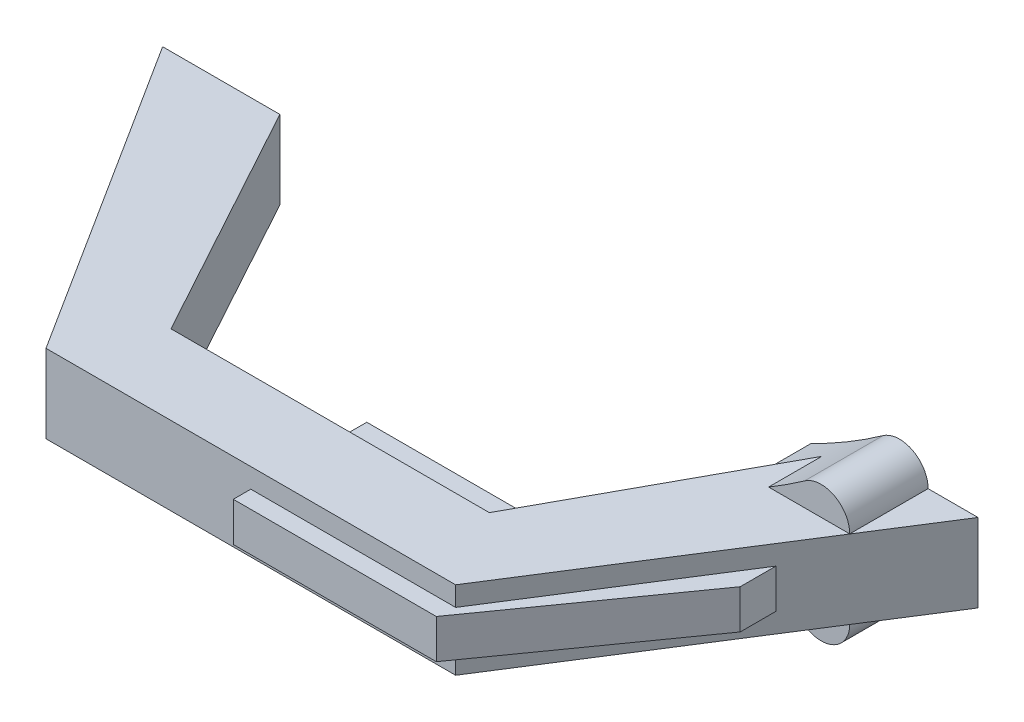
ISO-10303-21;
HEADER;
FILE_DESCRIPTION(('STEP AP214'),'2;1');
FILE_NAME('part.step','',(''),(''),'','','');
FILE_SCHEMA(('AUTOMOTIVE_DESIGN { 1 0 10303 214 1 1 1 1 }'));
ENDSEC;
DATA;
#1=APPLICATION_CONTEXT('core data for automotive mechanical design processes');
#2=APPLICATION_PROTOCOL_DEFINITION('international standard','automotive_design',2000,#1);
#3=PRODUCT_CONTEXT('',#1,'mechanical');
#4=PRODUCT('Part','Part','',(#3));
#5=PRODUCT_RELATED_PRODUCT_CATEGORY('part','',(#4));
#6=PRODUCT_DEFINITION_FORMATION('','',#4);
#7=PRODUCT_DEFINITION_CONTEXT('part definition',#1,'design');
#8=PRODUCT_DEFINITION('design','',#6,#7);
#9=PRODUCT_DEFINITION_SHAPE('','',#8);
#10=(LENGTH_UNIT() NAMED_UNIT(*) SI_UNIT(.MILLI.,.METRE.));
#11=(NAMED_UNIT(*) PLANE_ANGLE_UNIT() SI_UNIT($,.RADIAN.));
#12=(NAMED_UNIT(*) SI_UNIT($,.STERADIAN.) SOLID_ANGLE_UNIT());
#13=UNCERTAINTY_MEASURE_WITH_UNIT(LENGTH_MEASURE(1.E-05),#10,'distance_accuracy_value','');
#14=(GEOMETRIC_REPRESENTATION_CONTEXT(3) GLOBAL_UNCERTAINTY_ASSIGNED_CONTEXT((#13)) GLOBAL_UNIT_ASSIGNED_CONTEXT((#10,
#11,#12)) REPRESENTATION_CONTEXT('',''));
#15=CARTESIAN_POINT('',(0.,0.,0.));
#16=DIRECTION('',(0.,0.,1.));
#17=DIRECTION('',(1.,0.,0.));
#18=AXIS2_PLACEMENT_3D('',#15,#16,#17);
#19=CARTESIAN_POINT('',(37.0601413632238,-45.,94.5));
#20=DIRECTION('',(0.,0.,1.));
#21=DIRECTION('',(1.,0.,0.));
#22=AXIS2_PLACEMENT_3D('',#19,#20,#21);
#23=PLANE('',#22);
#24=DIRECTION('',(-1.,0.,0.));
#25=VECTOR('',#24,1.);
#26=CARTESIAN_POINT('',(37.0601413632238,-55.,94.5));
#27=LINE('',#26,#25);
#28=CARTESIAN_POINT('',(52.0177462673511,-55.,94.5));
#29=VERTEX_POINT('',#28);
#30=CARTESIAN_POINT('',(37.0601413632238,-55.,94.5));
#31=VERTEX_POINT('',#30);
#32=EDGE_CURVE('E135',#29,#31,#27,.T.);
#33=ORIENTED_EDGE('',*,*,#32,.T.);
#34=DIRECTION('',(0.,-1.,0.));
#35=VECTOR('',#34,1.);
#36=CARTESIAN_POINT('',(37.0601413632238,-45.,94.5));
#37=LINE('',#36,#35);
#38=CARTESIAN_POINT('',(37.0601413632238,-45.,94.5));
#39=VERTEX_POINT('',#38);
#40=EDGE_CURVE('E12',#39,#31,#37,.T.);
#41=ORIENTED_EDGE('',*,*,#40,.F.);
#42=DIRECTION('',(-1.,0.,0.));
#43=VECTOR('',#42,1.);
#44=CARTESIAN_POINT('',(37.0601413632238,-45.,94.5));
#45=LINE('',#44,#43);
#46=CARTESIAN_POINT('',(52.0177462673511,-45.,94.5));
#47=VERTEX_POINT('',#46);
#48=EDGE_CURVE('E161',#47,#39,#45,.T.);
#49=ORIENTED_EDGE('',*,*,#48,.F.);
#50=DIRECTION('',(0.,-1.,0.));
#51=VECTOR('',#50,1.);
#52=CARTESIAN_POINT('',(52.0177462673511,-45.,94.5));
#53=LINE('',#52,#51);
#54=EDGE_CURVE('E169',#47,#29,#53,.T.);
#55=ORIENTED_EDGE('',*,*,#54,.T.);
#56=EDGE_LOOP('',(#33,#41,#49,#55));
#57=FACE_BOUND('',#56,.T.);
#58=ADVANCED_FACE('F51',(#57),#23,.F.);
#59=CARTESIAN_POINT('',(37.0601413632238,-45.,94.5));
#60=DIRECTION('',(0.87745678006242,0.,0.479655708943915));
#61=DIRECTION('',(0.479655708943915,0.,-0.87745678006242));
#62=AXIS2_PLACEMENT_3D('',#59,#60,#61);
#63=PLANE('',#62);
#64=DIRECTION('',(-0.479655708943915,0.,0.87745678006242));
#65=VECTOR('',#64,1.);
#66=CARTESIAN_POINT('',(37.0601413632238,-55.,94.5));
#67=LINE('',#66,#65);
#68=CARTESIAN_POINT('',(20.3102461490372,-55.,125.141372232143));
#69=VERTEX_POINT('',#68);
#70=EDGE_CURVE('E172',#31,#69,#67,.T.);
#71=ORIENTED_EDGE('',*,*,#70,.T.);
#72=DIRECTION('',(0.,-1.,0.));
#73=VECTOR('',#72,1.);
#74=CARTESIAN_POINT('',(20.3102461490372,-45.,125.141372232143));
#75=LINE('',#74,#73);
#76=CARTESIAN_POINT('',(20.3102461490372,-45.,125.141372232143));
#77=VERTEX_POINT('',#76);
#78=EDGE_CURVE('E59',#77,#69,#75,.T.);
#79=ORIENTED_EDGE('',*,*,#78,.F.);
#80=DIRECTION('',(-0.479655708943915,0.,0.87745678006242));
#81=VECTOR('',#80,1.);
#82=CARTESIAN_POINT('',(37.0601413632238,-45.,94.5));
#83=LINE('',#82,#81);
#84=EDGE_CURVE('E98',#39,#77,#83,.T.);
#85=ORIENTED_EDGE('',*,*,#84,.F.);
#86=ORIENTED_EDGE('',*,*,#40,.T.);
#87=EDGE_LOOP('',(#71,#79,#85,#86));
#88=FACE_BOUND('',#87,.T.);
#89=ADVANCED_FACE('F199',(#88),#63,.F.);
#90=CARTESIAN_POINT('',(20.3102461490372,-45.,125.141372232143));
#91=DIRECTION('',(0.,0.,1.));
#92=DIRECTION('',(1.,0.,0.));
#93=AXIS2_PLACEMENT_3D('',#90,#91,#92);
#94=PLANE('',#93);
#95=DIRECTION('',(-1.,0.,0.));
#96=VECTOR('',#95,1.);
#97=CARTESIAN_POINT('',(20.3102461490372,-55.,125.141372232143));
#98=LINE('',#97,#96);
#99=CARTESIAN_POINT('',(-20.3102461490372,-55.,125.141372232143));
#100=VERTEX_POINT('',#99);
#101=EDGE_CURVE('E174',#69,#100,#98,.T.);
#102=ORIENTED_EDGE('',*,*,#101,.T.);
#103=DIRECTION('',(0.,-1.,0.));
#104=VECTOR('',#103,1.);
#105=CARTESIAN_POINT('',(-20.3102461490372,-45.,125.141372232143));
#106=LINE('',#105,#104);
#107=CARTESIAN_POINT('',(-20.3102461490372,-45.,125.141372232143));
#108=VERTEX_POINT('',#107);
#109=EDGE_CURVE('E157',#108,#100,#106,.T.);
#110=ORIENTED_EDGE('',*,*,#109,.F.);
#111=DIRECTION('',(-1.,0.,0.));
#112=VECTOR('',#111,1.);
#113=CARTESIAN_POINT('',(20.3102461490372,-45.,125.141372232143));
#114=LINE('',#113,#112);
#115=EDGE_CURVE('E164',#77,#108,#114,.T.);
#116=ORIENTED_EDGE('',*,*,#115,.F.);
#117=ORIENTED_EDGE('',*,*,#78,.T.);
#118=EDGE_LOOP('',(#102,#110,#116,#117));
#119=FACE_BOUND('',#118,.T.);
#120=ADVANCED_FACE('F184',(#119),#94,.F.);
#121=CARTESIAN_POINT('',(26.1329620558589,-45.,135.26783467879));
#122=DIRECTION('',(0.,0.,-1.));
#123=DIRECTION('',(-1.,0.,0.));
#124=AXIS2_PLACEMENT_3D('',#121,#122,#123);
#125=PLANE('',#124);
#126=DIRECTION('',(1.,0.,0.));
#127=VECTOR('',#126,1.);
#128=CARTESIAN_POINT('',(26.1329620558589,-55.,135.26783467879));
#129=LINE('',#128,#127);
#130=CARTESIAN_POINT('',(-26.1329620558589,-55.,135.26783467879));
#131=VERTEX_POINT('',#130);
#132=CARTESIAN_POINT('',(26.1329620558589,-55.,135.26783467879));
#133=VERTEX_POINT('',#132);
#134=EDGE_CURVE('E85',#131,#133,#129,.T.);
#135=ORIENTED_EDGE('',*,*,#134,.T.);
#136=DIRECTION('',(0.,-1.,0.));
#137=VECTOR('',#136,1.);
#138=CARTESIAN_POINT('',(26.1329620558589,-45.,135.26783467879));
#139=LINE('',#138,#137);
#140=CARTESIAN_POINT('',(26.1329620558589,-45.,135.26783467879));
#141=VERTEX_POINT('',#140);
#142=EDGE_CURVE('E179',#141,#133,#139,.T.);
#143=ORIENTED_EDGE('',*,*,#142,.F.);
#144=DIRECTION('',(1.,0.,0.));
#145=VECTOR('',#144,1.);
#146=CARTESIAN_POINT('',(26.1329620558589,-45.,135.26783467879));
#147=LINE('',#146,#145);
#148=CARTESIAN_POINT('',(-26.1329620558589,-45.,135.26783467879));
#149=VERTEX_POINT('',#148);
#150=EDGE_CURVE('E166',#149,#141,#147,.T.);
#151=ORIENTED_EDGE('',*,*,#150,.F.);
#152=DIRECTION('',(0.,-1.,0.));
#153=VECTOR('',#152,1.);
#154=CARTESIAN_POINT('',(-26.1329620558589,-45.,135.26783467879));
#155=LINE('',#154,#153);
#156=EDGE_CURVE('E136',#149,#131,#155,.T.);
#157=ORIENTED_EDGE('',*,*,#156,.T.);
#158=EDGE_LOOP('',(#135,#143,#151,#157));
#159=FACE_BOUND('',#158,.T.);
#160=ADVANCED_FACE('F206',(#159),#125,.F.);
#161=CARTESIAN_POINT('',(52.0177462673511,-45.,94.5));
#162=DIRECTION('',(-0.844208647922649,0.,-0.536014700146005));
#163=DIRECTION('',(-0.536014700146005,0.,0.844208647922649));
#164=AXIS2_PLACEMENT_3D('',#161,#162,#163);
#165=PLANE('',#164);
#166=DIRECTION('',(0.536014700146005,0.,-0.844208647922649));
#167=VECTOR('',#166,1.);
#168=CARTESIAN_POINT('',(52.0177462673511,-55.,94.5));
#169=LINE('',#168,#167);
#170=EDGE_CURVE('E91',#133,#29,#169,.T.);
#171=ORIENTED_EDGE('',*,*,#170,.T.);
#172=ORIENTED_EDGE('',*,*,#54,.F.);
#173=DIRECTION('',(0.536014700146005,0.,-0.844208647922649));
#174=VECTOR('',#173,1.);
#175=CARTESIAN_POINT('',(52.0177462673511,-45.,94.5));
#176=LINE('',#175,#174);
#177=EDGE_CURVE('E67',#141,#47,#176,.T.);
#178=ORIENTED_EDGE('',*,*,#177,.F.);
#179=ORIENTED_EDGE('',*,*,#142,.T.);
#180=EDGE_LOOP('',(#171,#172,#178,#179));
#181=FACE_BOUND('',#180,.T.);
#182=ADVANCED_FACE('F207',(#181),#165,.F.);
#183=CARTESIAN_POINT('',(0.,-45.,0.));
#184=DIRECTION('',(0.,-1.,0.));
#185=DIRECTION('',(0.,0.,-1.));
#186=AXIS2_PLACEMENT_3D('',#183,#184,#185);
#187=PLANE('',#186);
#188=ORIENTED_EDGE('',*,*,#48,.T.);
#189=ORIENTED_EDGE('',*,*,#84,.T.);
#190=ORIENTED_EDGE('',*,*,#115,.T.);
#191=DIRECTION('',(0.479655708943915,0.,0.87745678006242));
#192=VECTOR('',#191,1.);
#193=CARTESIAN_POINT('',(-37.0601413632238,-45.,94.5));
#194=LINE('',#193,#192);
#195=CARTESIAN_POINT('',(-37.0601413632238,-45.,94.5));
#196=VERTEX_POINT('',#195);
#197=EDGE_CURVE('E142',#196,#108,#194,.T.);
#198=ORIENTED_EDGE('',*,*,#197,.F.);
#199=DIRECTION('',(1.,0.,0.));
#200=VECTOR('',#199,1.);
#201=CARTESIAN_POINT('',(-37.0601413632238,-45.,94.5));
#202=LINE('',#201,#200);
#203=CARTESIAN_POINT('',(-52.0177462673511,-45.,94.5));
#204=VERTEX_POINT('',#203);
#205=EDGE_CURVE('E127',#204,#196,#202,.T.);
#206=ORIENTED_EDGE('',*,*,#205,.F.);
#207=DIRECTION('',(-0.536014700146005,0.,-0.844208647922649));
#208=VECTOR('',#207,1.);
#209=CARTESIAN_POINT('',(-52.0177462673511,-45.,94.5));
#210=LINE('',#209,#208);
#211=EDGE_CURVE('E140',#149,#204,#210,.T.);
#212=ORIENTED_EDGE('',*,*,#211,.F.);
#213=ORIENTED_EDGE('',*,*,#150,.T.);
#214=ORIENTED_EDGE('',*,*,#177,.T.);
#215=EDGE_LOOP('',(#188,#189,#190,#198,#206,#212,#213,#214));
#216=FACE_BOUND('',#215,.T.);
#217=ADVANCED_FACE('F139',(#216),#187,.F.);
#218=CARTESIAN_POINT('',(0.,-55.,0.));
#219=DIRECTION('',(0.,-1.,0.));
#220=DIRECTION('',(0.,0.,-1.));
#221=AXIS2_PLACEMENT_3D('',#218,#219,#220);
#222=PLANE('',#221);
#223=ORIENTED_EDGE('',*,*,#32,.F.);
#224=ORIENTED_EDGE('',*,*,#170,.F.);
#225=ORIENTED_EDGE('',*,*,#134,.F.);
#226=DIRECTION('',(-0.536014700146005,0.,-0.844208647922649));
#227=VECTOR('',#226,1.);
#228=CARTESIAN_POINT('',(-52.0177462673511,-55.,94.5));
#229=LINE('',#228,#227);
#230=CARTESIAN_POINT('',(-52.0177462673511,-55.,94.5));
#231=VERTEX_POINT('',#230);
#232=EDGE_CURVE('E152',#131,#231,#229,.T.);
#233=ORIENTED_EDGE('',*,*,#232,.T.);
#234=DIRECTION('',(1.,0.,0.));
#235=VECTOR('',#234,1.);
#236=CARTESIAN_POINT('',(-37.0601413632238,-55.,94.5));
#237=LINE('',#236,#235);
#238=CARTESIAN_POINT('',(-37.0601413632238,-55.,94.5));
#239=VERTEX_POINT('',#238);
#240=EDGE_CURVE('E130',#231,#239,#237,.T.);
#241=ORIENTED_EDGE('',*,*,#240,.T.);
#242=DIRECTION('',(0.479655708943915,0.,0.87745678006242));
#243=VECTOR('',#242,1.);
#244=CARTESIAN_POINT('',(-37.0601413632238,-55.,94.5));
#245=LINE('',#244,#243);
#246=EDGE_CURVE('E143',#239,#100,#245,.T.);
#247=ORIENTED_EDGE('',*,*,#246,.T.);
#248=ORIENTED_EDGE('',*,*,#101,.F.);
#249=ORIENTED_EDGE('',*,*,#70,.F.);
#250=EDGE_LOOP('',(#223,#224,#225,#233,#241,#247,#248,#249));
#251=FACE_BOUND('',#250,.T.);
#252=ADVANCED_FACE('F188',(#251),#222,.T.);
#253=CARTESIAN_POINT('',(-37.0601413632238,-45.,94.5));
#254=DIRECTION('',(0.,0.,-1.));
#255=DIRECTION('',(-1.,0.,0.));
#256=AXIS2_PLACEMENT_3D('',#253,#254,#255);
#257=PLANE('',#256);
#258=ORIENTED_EDGE('',*,*,#240,.F.);
#259=DIRECTION('',(0.,-1.,0.));
#260=VECTOR('',#259,1.);
#261=CARTESIAN_POINT('',(-52.0177462673511,-45.,94.5));
#262=LINE('',#261,#260);
#263=EDGE_CURVE('E124',#204,#231,#262,.T.);
#264=ORIENTED_EDGE('',*,*,#263,.F.);
#265=ORIENTED_EDGE('',*,*,#205,.T.);
#266=DIRECTION('',(0.,-1.,0.));
#267=VECTOR('',#266,1.);
#268=CARTESIAN_POINT('',(-37.0601413632238,-45.,94.5));
#269=LINE('',#268,#267);
#270=EDGE_CURVE('E148',#196,#239,#269,.T.);
#271=ORIENTED_EDGE('',*,*,#270,.T.);
#272=EDGE_LOOP('',(#258,#264,#265,#271));
#273=FACE_BOUND('',#272,.T.);
#274=ADVANCED_FACE('F126',(#273),#257,.T.);
#275=CARTESIAN_POINT('',(-52.0177462673511,-45.,94.5));
#276=DIRECTION('',(-0.844208647922649,0.,0.536014700146005));
#277=DIRECTION('',(0.536014700146005,0.,0.844208647922649));
#278=AXIS2_PLACEMENT_3D('',#275,#276,#277);
#279=PLANE('',#278);
#280=ORIENTED_EDGE('',*,*,#232,.F.);
#281=ORIENTED_EDGE('',*,*,#156,.F.);
#282=ORIENTED_EDGE('',*,*,#211,.T.);
#283=ORIENTED_EDGE('',*,*,#263,.T.);
#284=EDGE_LOOP('',(#280,#281,#282,#283));
#285=FACE_BOUND('',#284,.T.);
#286=ADVANCED_FACE('F146',(#285),#279,.T.);
#287=CARTESIAN_POINT('',(-37.0601413632238,-45.,94.5));
#288=DIRECTION('',(0.87745678006242,0.,-0.479655708943915));
#289=DIRECTION('',(-0.479655708943915,0.,-0.87745678006242));
#290=AXIS2_PLACEMENT_3D('',#287,#288,#289);
#291=PLANE('',#290);
#292=ORIENTED_EDGE('',*,*,#246,.F.);
#293=ORIENTED_EDGE('',*,*,#270,.F.);
#294=ORIENTED_EDGE('',*,*,#197,.T.);
#295=ORIENTED_EDGE('',*,*,#109,.T.);
#296=EDGE_LOOP('',(#292,#293,#294,#295));
#297=FACE_BOUND('',#296,.T.);
#298=ADVANCED_FACE('F191',(#297),#291,.T.);
#299=CLOSED_SHELL('',(#58,#89,#120,#160,#182,#217,#252,#274,#286,#298));
#300=MANIFOLD_SOLID_BREP('B2',#299);
#301=CARTESIAN_POINT('',(0.,-47.5,0.));
#302=DIRECTION('',(0.,-1.,0.));
#303=DIRECTION('',(0.,0.,-1.));
#304=AXIS2_PLACEMENT_3D('',#301,#302,#303);
#305=PLANE('',#304);
#306=DIRECTION('',(-1.,0.,0.));
#307=VECTOR('',#306,1.);
#308=CARTESIAN_POINT('',(0.,-47.5,104.5));
#309=LINE('',#308,#307);
#310=CARTESIAN_POINT('',(42.,-47.5,104.5));
#311=VERTEX_POINT('',#310);
#312=CARTESIAN_POINT('',(30.6904076067072,-47.5,104.5));
#313=VERTEX_POINT('',#312);
#314=EDGE_CURVE('E49',#311,#313,#309,.T.);
#315=ORIENTED_EDGE('',*,*,#314,.T.);
#316=DIRECTION('',(0.,0.,1.));
#317=VECTOR('',#316,1.);
#318=CARTESIAN_POINT('',(30.6904076067072,-47.5,109.041812897037));
#319=LINE('',#318,#317);
#320=CARTESIAN_POINT('',(30.6904076067072,-47.5,109.041812897037));
#321=VERTEX_POINT('',#320);
#322=EDGE_CURVE('E439',#313,#321,#319,.T.);
#323=ORIENTED_EDGE('',*,*,#322,.T.);
#324=DIRECTION('',(-0.582399798292052,0.,0.812902500272559));
#325=VECTOR('',#324,1.);
#326=CARTESIAN_POINT('',(30.6904076067072,-47.5,109.041812897037));
#327=LINE('',#326,#325);
#328=CARTESIAN_POINT('',(22.5,-47.5,120.473827195924));
#329=VERTEX_POINT('',#328);
#330=EDGE_CURVE('E463',#321,#329,#327,.T.);
#331=ORIENTED_EDGE('',*,*,#330,.T.);
#332=DIRECTION('',(-1.,0.,0.));
#333=VECTOR('',#332,1.);
#334=CARTESIAN_POINT('',(22.5,-47.5,120.473827195924));
#335=LINE('',#334,#333);
#336=CARTESIAN_POINT('',(0.,-47.5,120.473827195924));
#337=VERTEX_POINT('',#336);
#338=EDGE_CURVE('E461',#329,#337,#335,.T.);
#339=ORIENTED_EDGE('',*,*,#338,.T.);
#340=DIRECTION('',(0.,0.,1.));
#341=VECTOR('',#340,1.);
#342=CARTESIAN_POINT('',(0.,-47.5,137.5));
#343=LINE('',#342,#341);
#344=CARTESIAN_POINT('',(0.,-47.5,137.5));
#345=VERTEX_POINT('',#344);
#346=EDGE_CURVE('E459',#337,#345,#343,.T.);
#347=ORIENTED_EDGE('',*,*,#346,.T.);
#348=DIRECTION('',(1.,0.,0.));
#349=VECTOR('',#348,1.);
#350=CARTESIAN_POINT('',(25.9004033856823,-47.5,137.5));
#351=LINE('',#350,#349);
#352=CARTESIAN_POINT('',(25.9004033856823,-47.5,137.5));
#353=VERTEX_POINT('',#352);
#354=EDGE_CURVE('E457',#345,#353,#351,.T.);
#355=ORIENTED_EDGE('',*,*,#354,.T.);
#356=DIRECTION('',(0.57886181381937,0.,-0.815425656023742));
#357=VECTOR('',#356,1.);
#358=CARTESIAN_POINT('',(42.,-47.5,114.820970536426));
#359=LINE('',#358,#357);
#360=CARTESIAN_POINT('',(42.,-47.5,114.820970536426));
#361=VERTEX_POINT('',#360);
#362=EDGE_CURVE('E455',#353,#361,#359,.T.);
#363=ORIENTED_EDGE('',*,*,#362,.T.);
#364=DIRECTION('',(0.,0.,-1.));
#365=VECTOR('',#364,1.);
#366=CARTESIAN_POINT('',(42.,-47.5,94.5));
#367=LINE('',#366,#365);
#368=EDGE_CURVE('E435',#361,#311,#367,.T.);
#369=ORIENTED_EDGE('',*,*,#368,.T.);
#370=EDGE_LOOP('',(#315,#323,#331,#339,#347,#355,#363,#369));
#371=FACE_BOUND('',#370,.T.);
#372=ADVANCED_FACE('F291',(#371),#305,.F.);
#373=CARTESIAN_POINT('',(42.,-55.,104.5));
#374=DIRECTION('',(0.,0.,-1.));
#375=DIRECTION('',(-1.,0.,0.));
#376=AXIS2_PLACEMENT_3D('',#373,#374,#375);
#377=CYLINDRICAL_SURFACE('',#376,3.65);
#378=DIRECTION('',(0.,0.,-1.));
#379=VECTOR('',#378,1.);
#380=CARTESIAN_POINT('',(39.8898938834937,-57.9782464936742,104.5));
#381=LINE('',#380,#379);
#382=CARTESIAN_POINT('',(39.8898938834937,-57.9782464936742,104.5));
#383=VERTEX_POINT('',#382);
#384=CARTESIAN_POINT('',(39.8898938834937,-57.9782464936742,94.5));
#385=VERTEX_POINT('',#384);
#386=EDGE_CURVE('E393',#383,#385,#381,.T.);
#387=ORIENTED_EDGE('',*,*,#386,.T.);
#388=CARTESIAN_POINT('',(42.,-55.,94.5));
#389=DIRECTION('',(0.,0.,1.));
#390=DIRECTION('',(1.,0.,0.));
#391=AXIS2_PLACEMENT_3D('',#388,#389,#390);
#392=CIRCLE('',#391,3.65);
#393=CARTESIAN_POINT('',(42.,-51.35,94.5));
#394=VERTEX_POINT('',#393);
#395=EDGE_CURVE('E404',#385,#394,#392,.T.);
#396=ORIENTED_EDGE('',*,*,#395,.T.);
#397=DIRECTION('',(0.,0.,-1.));
#398=VECTOR('',#397,1.);
#399=CARTESIAN_POINT('',(42.,-51.35,104.5));
#400=LINE('',#399,#398);
#401=CARTESIAN_POINT('',(42.,-51.35,104.5));
#402=VERTEX_POINT('',#401);
#403=EDGE_CURVE('E402',#402,#394,#400,.T.);
#404=ORIENTED_EDGE('',*,*,#403,.F.);
#405=CARTESIAN_POINT('',(42.,-55.,104.5));
#406=DIRECTION('',(0.,0.,1.));
#407=DIRECTION('',(1.,0.,0.));
#408=AXIS2_PLACEMENT_3D('',#405,#406,#407);
#409=CIRCLE('',#408,3.65);
#410=EDGE_CURVE('E299',#383,#402,#409,.T.);
#411=ORIENTED_EDGE('',*,*,#410,.F.);
#412=EDGE_LOOP('',(#387,#396,#404,#411));
#413=FACE_BOUND('',#412,.T.);
#414=ADVANCED_FACE('F293',(#413),#377,.T.);
#415=CARTESIAN_POINT('',(0.,-52.5,0.));
#416=DIRECTION('',(0.,-1.,0.));
#417=DIRECTION('',(0.,0.,-1.));
#418=AXIS2_PLACEMENT_3D('',#415,#416,#417);
#419=PLANE('',#418);
#420=DIRECTION('',(0.,0.,1.));
#421=VECTOR('',#420,1.);
#422=CARTESIAN_POINT('',(30.6904076067072,-52.5,109.041812897037));
#423=LINE('',#422,#421);
#424=CARTESIAN_POINT('',(30.6904076067072,-52.5,104.5));
#425=VERTEX_POINT('',#424);
#426=CARTESIAN_POINT('',(30.6904076067072,-52.5,109.041812897037));
#427=VERTEX_POINT('',#426);
#428=EDGE_CURVE('E453',#425,#427,#423,.T.);
#429=ORIENTED_EDGE('',*,*,#428,.F.);
#430=DIRECTION('',(1.,0.,0.));
#431=VECTOR('',#430,1.);
#432=CARTESIAN_POINT('',(42.,-52.5,104.5));
#433=LINE('',#432,#431);
#434=CARTESIAN_POINT('',(42.,-52.5,104.5));
#435=VERTEX_POINT('',#434);
#436=EDGE_CURVE('E312',#425,#435,#433,.T.);
#437=ORIENTED_EDGE('',*,*,#436,.T.);
#438=DIRECTION('',(0.,0.,-1.));
#439=VECTOR('',#438,1.);
#440=CARTESIAN_POINT('',(42.,-52.5,94.5));
#441=LINE('',#440,#439);
#442=CARTESIAN_POINT('',(42.,-52.5,114.820970536426));
#443=VERTEX_POINT('',#442);
#444=EDGE_CURVE('E436',#443,#435,#441,.T.);
#445=ORIENTED_EDGE('',*,*,#444,.F.);
#446=DIRECTION('',(0.57886181381937,0.,-0.815425656023742));
#447=VECTOR('',#446,1.);
#448=CARTESIAN_POINT('',(42.,-52.5,114.820970536426));
#449=LINE('',#448,#447);
#450=CARTESIAN_POINT('',(25.9004033856823,-52.5,137.5));
#451=VERTEX_POINT('',#450);
#452=EDGE_CURVE('E440',#451,#443,#449,.T.);
#453=ORIENTED_EDGE('',*,*,#452,.F.);
#454=DIRECTION('',(1.,0.,0.));
#455=VECTOR('',#454,1.);
#456=CARTESIAN_POINT('',(25.9004033856823,-52.5,137.5));
#457=LINE('',#456,#455);
#458=CARTESIAN_POINT('',(0.,-52.5,137.5));
#459=VERTEX_POINT('',#458);
#460=EDGE_CURVE('E442',#459,#451,#457,.T.);
#461=ORIENTED_EDGE('',*,*,#460,.F.);
#462=DIRECTION('',(0.,0.,1.));
#463=VECTOR('',#462,1.);
#464=CARTESIAN_POINT('',(0.,-52.5,137.5));
#465=LINE('',#464,#463);
#466=CARTESIAN_POINT('',(0.,-52.5,120.473827195924));
#467=VERTEX_POINT('',#466);
#468=EDGE_CURVE('E444',#467,#459,#465,.T.);
#469=ORIENTED_EDGE('',*,*,#468,.F.);
#470=DIRECTION('',(-1.,0.,0.));
#471=VECTOR('',#470,1.);
#472=CARTESIAN_POINT('',(22.5,-52.5,120.473827195924));
#473=LINE('',#472,#471);
#474=CARTESIAN_POINT('',(22.5,-52.5,120.473827195924));
#475=VERTEX_POINT('',#474);
#476=EDGE_CURVE('E446',#475,#467,#473,.T.);
#477=ORIENTED_EDGE('',*,*,#476,.F.);
#478=DIRECTION('',(-0.582399798292052,0.,0.812902500272559));
#479=VECTOR('',#478,1.);
#480=CARTESIAN_POINT('',(30.6904076067072,-52.5,109.041812897037));
#481=LINE('',#480,#479);
#482=EDGE_CURVE('E448',#427,#475,#481,.T.);
#483=ORIENTED_EDGE('',*,*,#482,.F.);
#484=EDGE_LOOP('',(#429,#437,#445,#453,#461,#469,#477,#483));
#485=FACE_BOUND('',#484,.T.);
#486=ADVANCED_FACE('F506',(#485),#419,.T.);
#487=CARTESIAN_POINT('',(42.,-45.,104.5));
#488=DIRECTION('',(0.,0.,-1.));
#489=DIRECTION('',(-1.,0.,0.));
#490=AXIS2_PLACEMENT_3D('',#487,#488,#489);
#491=CYLINDRICAL_SURFACE('',#490,3.65);
#492=DIRECTION('',(0.,0.,-1.));
#493=VECTOR('',#492,1.);
#494=CARTESIAN_POINT('',(39.8898938834937,-42.0217535063258,104.5));
#495=LINE('',#494,#493);
#496=CARTESIAN_POINT('',(39.8898938834937,-42.0217535063258,104.5));
#497=VERTEX_POINT('',#496);
#498=CARTESIAN_POINT('',(39.8898938834937,-42.0217535063258,94.5));
#499=VERTEX_POINT('',#498);
#500=EDGE_CURVE('E389',#497,#499,#495,.T.);
#501=ORIENTED_EDGE('',*,*,#500,.F.);
#502=CARTESIAN_POINT('',(42.,-45.,104.5));
#503=DIRECTION('',(0.,0.,1.));
#504=DIRECTION('',(1.,0.,0.));
#505=AXIS2_PLACEMENT_3D('',#502,#503,#504);
#506=CIRCLE('',#505,3.65);
#507=CARTESIAN_POINT('',(42.,-48.65,104.5));
#508=VERTEX_POINT('',#507);
#509=EDGE_CURVE('E399',#508,#497,#506,.T.);
#510=ORIENTED_EDGE('',*,*,#509,.F.);
#511=DIRECTION('',(0.,0.,-1.));
#512=VECTOR('',#511,1.);
#513=CARTESIAN_POINT('',(42.,-48.65,104.5));
#514=LINE('',#513,#512);
#515=CARTESIAN_POINT('',(42.,-48.65,94.5));
#516=VERTEX_POINT('',#515);
#517=EDGE_CURVE('E468',#508,#516,#514,.T.);
#518=ORIENTED_EDGE('',*,*,#517,.T.);
#519=CARTESIAN_POINT('',(42.,-45.,94.5));
#520=DIRECTION('',(0.,0.,1.));
#521=DIRECTION('',(1.,0.,0.));
#522=AXIS2_PLACEMENT_3D('',#519,#520,#521);
#523=CIRCLE('',#522,3.65);
#524=EDGE_CURVE('E473',#516,#499,#523,.T.);
#525=ORIENTED_EDGE('',*,*,#524,.T.);
#526=EDGE_LOOP('',(#501,#510,#518,#525));
#527=FACE_BOUND('',#526,.T.);
#528=ADVANCED_FACE('F531',(#527),#491,.T.);
#529=CARTESIAN_POINT('',(42.,-47.5,94.5));
#530=DIRECTION('',(-1.,0.,0.));
#531=DIRECTION('',(0.,0.,1.));
#532=AXIS2_PLACEMENT_3D('',#529,#530,#531);
#533=PLANE('',#532);
#534=ORIENTED_EDGE('',*,*,#517,.F.);
#535=DIRECTION('',(0.,1.,0.));
#536=VECTOR('',#535,1.);
#537=CARTESIAN_POINT('',(42.,-47.5,104.5));
#538=LINE('',#537,#536);
#539=EDGE_CURVE('E471',#508,#311,#538,.T.);
#540=ORIENTED_EDGE('',*,*,#539,.T.);
#541=ORIENTED_EDGE('',*,*,#368,.F.);
#542=DIRECTION('',(0.,-1.,0.));
#543=VECTOR('',#542,1.);
#544=CARTESIAN_POINT('',(42.,-47.5,114.820970536426));
#545=LINE('',#544,#543);
#546=EDGE_CURVE('E429',#361,#443,#545,.T.);
#547=ORIENTED_EDGE('',*,*,#546,.T.);
#548=ORIENTED_EDGE('',*,*,#444,.T.);
#549=DIRECTION('',(0.,-1.,0.));
#550=VECTOR('',#549,1.);
#551=CARTESIAN_POINT('',(42.,-55.,104.5));
#552=LINE('',#551,#550);
#553=EDGE_CURVE('E408',#402,#435,#552,.T.);
#554=ORIENTED_EDGE('',*,*,#553,.F.);
#555=ORIENTED_EDGE('',*,*,#403,.T.);
#556=DIRECTION('',(0.,-1.,0.));
#557=VECTOR('',#556,1.);
#558=CARTESIAN_POINT('',(42.,-47.5,94.5));
#559=LINE('',#558,#557);
#560=EDGE_CURVE('E432',#516,#394,#559,.T.);
#561=ORIENTED_EDGE('',*,*,#560,.F.);
#562=EDGE_LOOP('',(#534,#540,#541,#547,#548,#554,#555,#561));
#563=FACE_BOUND('',#562,.T.);
#564=ADVANCED_FACE('F500',(#563),#533,.F.);
#565=CARTESIAN_POINT('',(42.,-55.,104.5));
#566=DIRECTION('',(0.,0.,1.));
#567=DIRECTION('',(1.,0.,0.));
#568=AXIS2_PLACEMENT_3D('',#565,#566,#567);
#569=PLANE('',#568);
#570=ORIENTED_EDGE('',*,*,#436,.F.);
#571=CARTESIAN_POINT('',(0.826437917553428,-113.113199115863,104.5));
#572=DIRECTION('',(0.,0.,-1.));
#573=DIRECTION('',(-1.,0.,0.));
#574=AXIS2_PLACEMENT_3D('',#571,#572,#573);
#575=CIRCLE('',#574,67.5708264908312);
#576=EDGE_CURVE('E382',#425,#383,#575,.T.);
#577=ORIENTED_EDGE('',*,*,#576,.T.);
#578=ORIENTED_EDGE('',*,*,#410,.T.);
#579=ORIENTED_EDGE('',*,*,#553,.T.);
#580=EDGE_LOOP('',(#570,#577,#578,#579));
#581=FACE_BOUND('',#580,.T.);
#582=ADVANCED_FACE('F384',(#581),#569,.T.);
#583=CARTESIAN_POINT('',(42.,-55.,94.5));
#584=DIRECTION('',(0.,0.,1.));
#585=DIRECTION('',(1.,0.,0.));
#586=AXIS2_PLACEMENT_3D('',#583,#584,#585);
#587=PLANE('',#586);
#588=DIRECTION('',(0.,-1.,0.));
#589=VECTOR('',#588,1.);
#590=CARTESIAN_POINT('',(30.6904076067072,-47.5,94.5));
#591=LINE('',#590,#589);
#592=CARTESIAN_POINT('',(30.6904076067072,-47.5,94.5));
#593=VERTEX_POINT('',#592);
#594=CARTESIAN_POINT('',(30.6904076067072,-52.5,94.5));
#595=VERTEX_POINT('',#594);
#596=EDGE_CURVE('E411',#593,#595,#591,.T.);
#597=ORIENTED_EDGE('',*,*,#596,.F.);
#598=CARTESIAN_POINT('',(0.826437917553692,13.1131991158633,94.5));
#599=DIRECTION('',(0.,0.,-1.));
#600=DIRECTION('',(-1.,0.,0.));
#601=AXIS2_PLACEMENT_3D('',#598,#599,#600);
#602=CIRCLE('',#601,67.5708264908309);
#603=EDGE_CURVE('E480',#499,#593,#602,.T.);
#604=ORIENTED_EDGE('',*,*,#603,.F.);
#605=ORIENTED_EDGE('',*,*,#524,.F.);
#606=ORIENTED_EDGE('',*,*,#560,.T.);
#607=ORIENTED_EDGE('',*,*,#395,.F.);
#608=CARTESIAN_POINT('',(0.826437917553428,-113.113199115863,94.5));
#609=DIRECTION('',(0.,0.,-1.));
#610=DIRECTION('',(-1.,0.,0.));
#611=AXIS2_PLACEMENT_3D('',#608,#609,#610);
#612=CIRCLE('',#611,67.5708264908312);
#613=EDGE_CURVE('E396',#595,#385,#612,.T.);
#614=ORIENTED_EDGE('',*,*,#613,.F.);
#615=EDGE_LOOP('',(#597,#604,#605,#606,#607,#614));
#616=FACE_BOUND('',#615,.T.);
#617=ADVANCED_FACE('F497',(#616),#587,.F.);
#618=CARTESIAN_POINT('',(30.6904076067072,-47.5,109.041812897037));
#619=DIRECTION('',(1.,0.,0.));
#620=DIRECTION('',(0.,0.,-1.));
#621=AXIS2_PLACEMENT_3D('',#618,#619,#620);
#622=PLANE('',#621);
#623=EDGE_CURVE('E450',#595,#425,#423,.T.);
#624=ORIENTED_EDGE('',*,*,#623,.T.);
#625=ORIENTED_EDGE('',*,*,#428,.T.);
#626=DIRECTION('',(0.,-1.,0.));
#627=VECTOR('',#626,1.);
#628=CARTESIAN_POINT('',(30.6904076067072,-47.5,109.041812897037));
#629=LINE('',#628,#627);
#630=EDGE_CURVE('E414',#321,#427,#629,.T.);
#631=ORIENTED_EDGE('',*,*,#630,.F.);
#632=ORIENTED_EDGE('',*,*,#322,.F.);
#633=EDGE_CURVE('E465',#593,#313,#319,.T.);
#634=ORIENTED_EDGE('',*,*,#633,.F.);
#635=ORIENTED_EDGE('',*,*,#596,.T.);
#636=EDGE_LOOP('',(#624,#625,#631,#632,#634,#635));
#637=FACE_BOUND('',#636,.T.);
#638=ADVANCED_FACE('F494',(#637),#622,.F.);
#639=CARTESIAN_POINT('',(30.6904076067072,-47.5,109.041812897037));
#640=DIRECTION('',(0.812902500272559,0.,0.582399798292052));
#641=DIRECTION('',(0.582399798292052,0.,-0.812902500272559));
#642=AXIS2_PLACEMENT_3D('',#639,#640,#641);
#643=PLANE('',#642);
#644=ORIENTED_EDGE('',*,*,#482,.T.);
#645=DIRECTION('',(0.,-1.,0.));
#646=VECTOR('',#645,1.);
#647=CARTESIAN_POINT('',(22.5,-47.5,120.473827195924));
#648=LINE('',#647,#646);
#649=EDGE_CURVE('E417',#329,#475,#648,.T.);
#650=ORIENTED_EDGE('',*,*,#649,.F.);
#651=ORIENTED_EDGE('',*,*,#330,.F.);
#652=ORIENTED_EDGE('',*,*,#630,.T.);
#653=EDGE_LOOP('',(#644,#650,#651,#652));
#654=FACE_BOUND('',#653,.T.);
#655=ADVANCED_FACE('F512',(#654),#643,.F.);
#656=CARTESIAN_POINT('',(22.5,-47.5,120.473827195924));
#657=DIRECTION('',(0.,0.,1.));
#658=DIRECTION('',(1.,0.,0.));
#659=AXIS2_PLACEMENT_3D('',#656,#657,#658);
#660=PLANE('',#659);
#661=ORIENTED_EDGE('',*,*,#476,.T.);
#662=DIRECTION('',(0.,-1.,0.));
#663=VECTOR('',#662,1.);
#664=CARTESIAN_POINT('',(0.,-47.5,120.473827195924));
#665=LINE('',#664,#663);
#666=EDGE_CURVE('E420',#337,#467,#665,.T.);
#667=ORIENTED_EDGE('',*,*,#666,.F.);
#668=ORIENTED_EDGE('',*,*,#338,.F.);
#669=ORIENTED_EDGE('',*,*,#649,.T.);
#670=EDGE_LOOP('',(#661,#667,#668,#669));
#671=FACE_BOUND('',#670,.T.);
#672=ADVANCED_FACE('F519',(#671),#660,.F.);
#673=CARTESIAN_POINT('',(0.,-47.5,137.5));
#674=DIRECTION('',(1.,0.,0.));
#675=DIRECTION('',(0.,0.,-1.));
#676=AXIS2_PLACEMENT_3D('',#673,#674,#675);
#677=PLANE('',#676);
#678=ORIENTED_EDGE('',*,*,#468,.T.);
#679=DIRECTION('',(0.,-1.,0.));
#680=VECTOR('',#679,1.);
#681=CARTESIAN_POINT('',(0.,-47.5,137.5));
#682=LINE('',#681,#680);
#683=EDGE_CURVE('E423',#345,#459,#682,.T.);
#684=ORIENTED_EDGE('',*,*,#683,.F.);
#685=ORIENTED_EDGE('',*,*,#346,.F.);
#686=ORIENTED_EDGE('',*,*,#666,.T.);
#687=EDGE_LOOP('',(#678,#684,#685,#686));
#688=FACE_BOUND('',#687,.T.);
#689=ADVANCED_FACE('F522',(#688),#677,.F.);
#690=CARTESIAN_POINT('',(25.9004033856823,-47.5,137.5));
#691=DIRECTION('',(0.,0.,-1.));
#692=DIRECTION('',(-1.,0.,0.));
#693=AXIS2_PLACEMENT_3D('',#690,#691,#692);
#694=PLANE('',#693);
#695=ORIENTED_EDGE('',*,*,#460,.T.);
#696=DIRECTION('',(0.,-1.,0.));
#697=VECTOR('',#696,1.);
#698=CARTESIAN_POINT('',(25.9004033856823,-47.5,137.5));
#699=LINE('',#698,#697);
#700=EDGE_CURVE('E426',#353,#451,#699,.T.);
#701=ORIENTED_EDGE('',*,*,#700,.F.);
#702=ORIENTED_EDGE('',*,*,#354,.F.);
#703=ORIENTED_EDGE('',*,*,#683,.T.);
#704=EDGE_LOOP('',(#695,#701,#702,#703));
#705=FACE_BOUND('',#704,.T.);
#706=ADVANCED_FACE('F526',(#705),#694,.F.);
#707=CARTESIAN_POINT('',(42.,-47.5,114.820970536426));
#708=DIRECTION('',(-0.815425656023742,0.,-0.57886181381937));
#709=DIRECTION('',(-0.57886181381937,0.,0.815425656023742));
#710=AXIS2_PLACEMENT_3D('',#707,#708,#709);
#711=PLANE('',#710);
#712=ORIENTED_EDGE('',*,*,#452,.T.);
#713=ORIENTED_EDGE('',*,*,#546,.F.);
#714=ORIENTED_EDGE('',*,*,#362,.F.);
#715=ORIENTED_EDGE('',*,*,#700,.T.);
#716=EDGE_LOOP('',(#712,#713,#714,#715));
#717=FACE_BOUND('',#716,.T.);
#718=ADVANCED_FACE('F529',(#717),#711,.F.);
#719=CARTESIAN_POINT('',(42.,-45.,104.5));
#720=DIRECTION('',(0.,0.,1.));
#721=DIRECTION('',(1.,0.,0.));
#722=AXIS2_PLACEMENT_3D('',#719,#720,#721);
#723=PLANE('',#722);
#724=CARTESIAN_POINT('',(0.826437917553692,13.1131991158633,104.5));
#725=DIRECTION('',(0.,0.,-1.));
#726=DIRECTION('',(-1.,0.,0.));
#727=AXIS2_PLACEMENT_3D('',#724,#725,#726);
#728=CIRCLE('',#727,67.5708264908309);
#729=EDGE_CURVE('E390',#497,#313,#728,.T.);
#730=ORIENTED_EDGE('',*,*,#729,.T.);
#731=ORIENTED_EDGE('',*,*,#314,.F.);
#732=ORIENTED_EDGE('',*,*,#539,.F.);
#733=ORIENTED_EDGE('',*,*,#509,.T.);
#734=EDGE_LOOP('',(#730,#731,#732,#733));
#735=FACE_BOUND('',#734,.T.);
#736=ADVANCED_FACE('F486',(#735),#723,.T.);
#737=CARTESIAN_POINT('',(0.826437917553692,13.1131991158633,104.5));
#738=DIRECTION('',(0.,0.,-1.));
#739=DIRECTION('',(-1.,0.,0.));
#740=AXIS2_PLACEMENT_3D('',#737,#738,#739);
#741=CYLINDRICAL_SURFACE('',#740,67.5708264908309);
#742=ORIENTED_EDGE('',*,*,#603,.T.);
#743=ORIENTED_EDGE('',*,*,#633,.T.);
#744=ORIENTED_EDGE('',*,*,#729,.F.);
#745=ORIENTED_EDGE('',*,*,#500,.T.);
#746=EDGE_LOOP('',(#742,#743,#744,#745));
#747=FACE_BOUND('',#746,.T.);
#748=ADVANCED_FACE('F490',(#747),#741,.F.);
#749=CARTESIAN_POINT('',(0.826437917553428,-113.113199115863,104.5));
#750=DIRECTION('',(0.,0.,-1.));
#751=DIRECTION('',(-1.,0.,0.));
#752=AXIS2_PLACEMENT_3D('',#749,#750,#751);
#753=CYLINDRICAL_SURFACE('',#752,67.5708264908312);
#754=ORIENTED_EDGE('',*,*,#613,.T.);
#755=ORIENTED_EDGE('',*,*,#386,.F.);
#756=ORIENTED_EDGE('',*,*,#576,.F.);
#757=ORIENTED_EDGE('',*,*,#623,.F.);
#758=EDGE_LOOP('',(#754,#755,#756,#757));
#759=FACE_BOUND('',#758,.T.);
#760=ADVANCED_FACE('F394',(#759),#753,.F.);
#761=CLOSED_SHELL('',(#372,#414,#486,#528,#564,#582,#617,#638,#655,#672,#689,#706,#718,#736,
#748,#760));
#762=MANIFOLD_SOLID_BREP('B6',#761);
#763=ADVANCED_BREP_SHAPE_REPRESENTATION('',(#18,#300,#762),#14);
#764=SHAPE_DEFINITION_REPRESENTATION(#9,#763);
ENDSEC;
END-ISO-10303-21;
